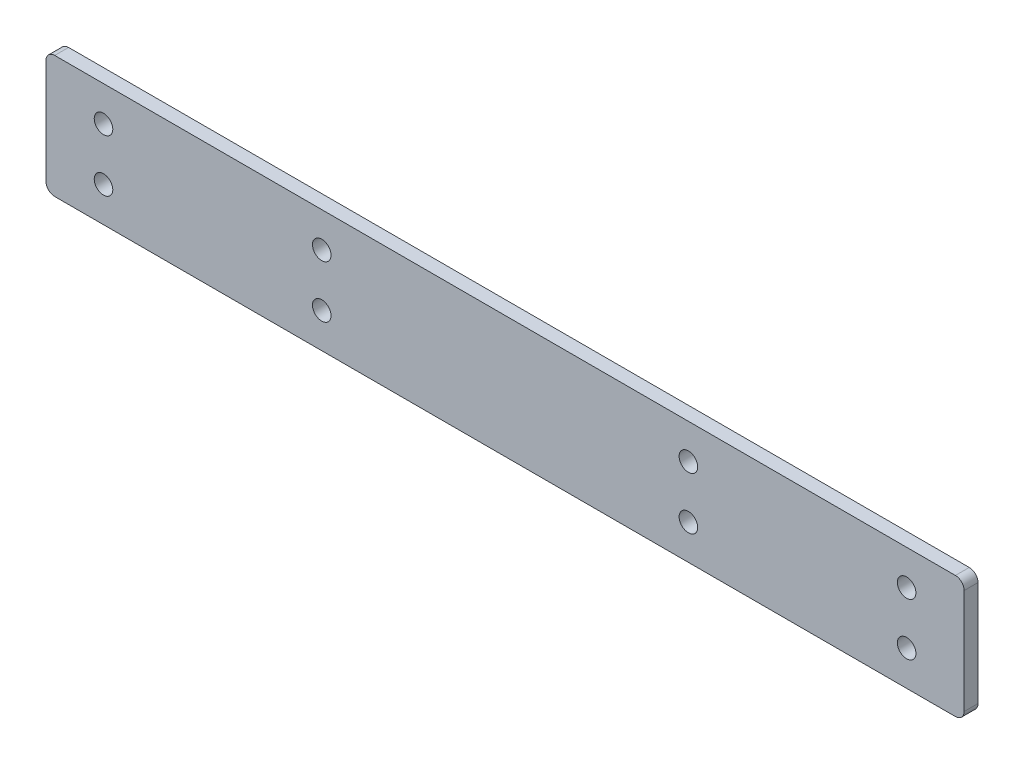
ISO-10303-21;
HEADER;
FILE_DESCRIPTION(('STEP AP214'),'2;1');
FILE_NAME('part.step','',(''),(''),'','','');
FILE_SCHEMA(('AUTOMOTIVE_DESIGN { 1 0 10303 214 1 1 1 1 }'));
ENDSEC;
DATA;
#1=APPLICATION_CONTEXT('core data for automotive mechanical design processes');
#2=APPLICATION_PROTOCOL_DEFINITION('international standard','automotive_design',2000,#1);
#3=PRODUCT_CONTEXT('',#1,'mechanical');
#4=PRODUCT('Part','Part','',(#3));
#5=PRODUCT_RELATED_PRODUCT_CATEGORY('part','',(#4));
#6=PRODUCT_DEFINITION_FORMATION('','',#4);
#7=PRODUCT_DEFINITION_CONTEXT('part definition',#1,'design');
#8=PRODUCT_DEFINITION('design','',#6,#7);
#9=PRODUCT_DEFINITION_SHAPE('','',#8);
#10=(LENGTH_UNIT() NAMED_UNIT(*) SI_UNIT(.MILLI.,.METRE.));
#11=(NAMED_UNIT(*) PLANE_ANGLE_UNIT() SI_UNIT($,.RADIAN.));
#12=(NAMED_UNIT(*) SI_UNIT($,.STERADIAN.) SOLID_ANGLE_UNIT());
#13=UNCERTAINTY_MEASURE_WITH_UNIT(LENGTH_MEASURE(1.E-05),#10,'distance_accuracy_value','');
#14=(GEOMETRIC_REPRESENTATION_CONTEXT(3) GLOBAL_UNCERTAINTY_ASSIGNED_CONTEXT((#13)) GLOBAL_UNIT_ASSIGNED_CONTEXT((#10,
#11,#12)) REPRESENTATION_CONTEXT('',''));
#15=CARTESIAN_POINT('',(0.,0.,0.));
#16=DIRECTION('',(0.,0.,1.));
#17=DIRECTION('',(1.,0.,0.));
#18=AXIS2_PLACEMENT_3D('',#15,#16,#17);
#19=CARTESIAN_POINT('',(0.,0.,3.175));
#20=DIRECTION('',(0.,0.,-1.));
#21=DIRECTION('',(-1.,0.,0.));
#22=AXIS2_PLACEMENT_3D('',#19,#20,#21);
#23=PLANE('',#22);
#24=DIRECTION('',(1.,0.,0.));
#25=VECTOR('',#24,1.);
#26=CARTESIAN_POINT('',(-105.175,-14.,3.175));
#27=LINE('',#26,#25);
#28=CARTESIAN_POINT('',(-103.175,-14.,3.175));
#29=VERTEX_POINT('',#28);
#30=CARTESIAN_POINT('',(103.175,-14.,3.175));
#31=VERTEX_POINT('',#30);
#32=EDGE_CURVE('E153',#29,#31,#27,.T.);
#33=ORIENTED_EDGE('',*,*,#32,.T.);
#34=CARTESIAN_POINT('',(103.175,-12.,3.175));
#35=DIRECTION('',(0.,0.,-1.));
#36=DIRECTION('',(-1.,0.,0.));
#37=AXIS2_PLACEMENT_3D('',#34,#35,#36);
#38=CIRCLE('',#37,2.);
#39=CARTESIAN_POINT('',(105.175,-12.,3.175));
#40=VERTEX_POINT('',#39);
#41=EDGE_CURVE('E183',#31,#40,#38,.F.);
#42=ORIENTED_EDGE('',*,*,#41,.T.);
#43=DIRECTION('',(0.,1.,0.));
#44=VECTOR('',#43,1.);
#45=CARTESIAN_POINT('',(105.175,-14.,3.175));
#46=LINE('',#45,#44);
#47=CARTESIAN_POINT('',(105.175,12.,3.175));
#48=VERTEX_POINT('',#47);
#49=EDGE_CURVE('E132',#40,#48,#46,.T.);
#50=ORIENTED_EDGE('',*,*,#49,.T.);
#51=CARTESIAN_POINT('',(103.175,12.,3.175));
#52=DIRECTION('',(0.,0.,-1.));
#53=DIRECTION('',(-1.,0.,0.));
#54=AXIS2_PLACEMENT_3D('',#51,#52,#53);
#55=CIRCLE('',#54,2.);
#56=CARTESIAN_POINT('',(103.175,14.,3.175));
#57=VERTEX_POINT('',#56);
#58=EDGE_CURVE('E180',#48,#57,#55,.F.);
#59=ORIENTED_EDGE('',*,*,#58,.T.);
#60=DIRECTION('',(-1.,0.,0.));
#61=VECTOR('',#60,1.);
#62=CARTESIAN_POINT('',(-105.175,14.,3.175));
#63=LINE('',#62,#61);
#64=CARTESIAN_POINT('',(-103.175,14.,3.175));
#65=VERTEX_POINT('',#64);
#66=EDGE_CURVE('E209',#57,#65,#63,.T.);
#67=ORIENTED_EDGE('',*,*,#66,.T.);
#68=CARTESIAN_POINT('',(-103.175,12.,3.175));
#69=DIRECTION('',(0.,0.,-1.));
#70=DIRECTION('',(-1.,0.,0.));
#71=AXIS2_PLACEMENT_3D('',#68,#69,#70);
#72=CIRCLE('',#71,2.);
#73=CARTESIAN_POINT('',(-105.175,12.,3.175));
#74=VERTEX_POINT('',#73);
#75=EDGE_CURVE('E66',#65,#74,#72,.F.);
#76=ORIENTED_EDGE('',*,*,#75,.T.);
#77=DIRECTION('',(0.,-1.,0.));
#78=VECTOR('',#77,1.);
#79=CARTESIAN_POINT('',(-105.175,-14.,3.175));
#80=LINE('',#79,#78);
#81=CARTESIAN_POINT('',(-105.175,-12.,3.175));
#82=VERTEX_POINT('',#81);
#83=EDGE_CURVE('E197',#74,#82,#80,.T.);
#84=ORIENTED_EDGE('',*,*,#83,.T.);
#85=CARTESIAN_POINT('',(-103.175,-12.,3.175));
#86=DIRECTION('',(0.,0.,-1.));
#87=DIRECTION('',(-1.,0.,0.));
#88=AXIS2_PLACEMENT_3D('',#85,#86,#87);
#89=CIRCLE('',#88,2.);
#90=EDGE_CURVE('E177',#82,#29,#89,.F.);
#91=ORIENTED_EDGE('',*,*,#90,.T.);
#92=EDGE_LOOP('',(#33,#42,#50,#59,#67,#76,#84,#91));
#93=FACE_BOUND('',#92,.T.);
#94=CARTESIAN_POINT('',(92.,6.,3.175));
#95=DIRECTION('',(0.,0.,1.));
#96=DIRECTION('',(1.,0.,0.));
#97=AXIS2_PLACEMENT_3D('',#94,#95,#96);
#98=CIRCLE('',#97,2.125);
#99=CARTESIAN_POINT('',(94.125,6.,3.175));
#100=VERTEX_POINT('',#99);
#101=EDGE_CURVE('E142',#100,#100,#98,.T.);
#102=ORIENTED_EDGE('',*,*,#101,.F.);
#103=EDGE_LOOP('',(#102));
#104=FACE_BOUND('',#103,.T.);
#105=CARTESIAN_POINT('',(92.,-6.,3.175));
#106=DIRECTION('',(0.,0.,1.));
#107=DIRECTION('',(-1.,0.,0.));
#108=AXIS2_PLACEMENT_3D('',#105,#106,#107);
#109=CIRCLE('',#108,2.125);
#110=CARTESIAN_POINT('',(89.875,-6.,3.175));
#111=VERTEX_POINT('',#110);
#112=EDGE_CURVE('E217',#111,#111,#109,.T.);
#113=ORIENTED_EDGE('',*,*,#112,.F.);
#114=EDGE_LOOP('',(#113));
#115=FACE_BOUND('',#114,.T.);
#116=CARTESIAN_POINT('',(-92.,-6.00000000000002,3.175));
#117=DIRECTION('',(0.,0.,1.));
#118=DIRECTION('',(1.,0.,0.));
#119=AXIS2_PLACEMENT_3D('',#116,#117,#118);
#120=CIRCLE('',#119,2.125);
#121=CARTESIAN_POINT('',(-89.875,-6.00000000000002,3.175));
#122=VERTEX_POINT('',#121);
#123=EDGE_CURVE('E223',#122,#122,#120,.T.);
#124=ORIENTED_EDGE('',*,*,#123,.F.);
#125=EDGE_LOOP('',(#124));
#126=FACE_BOUND('',#125,.T.);
#127=CARTESIAN_POINT('',(-92.,5.99999999999998,3.175));
#128=DIRECTION('',(0.,0.,1.));
#129=DIRECTION('',(-1.,0.,0.));
#130=AXIS2_PLACEMENT_3D('',#127,#128,#129);
#131=CIRCLE('',#130,2.125);
#132=CARTESIAN_POINT('',(-94.125,5.99999999999998,3.175));
#133=VERTEX_POINT('',#132);
#134=EDGE_CURVE('E231',#133,#133,#131,.T.);
#135=ORIENTED_EDGE('',*,*,#134,.F.);
#136=EDGE_LOOP('',(#135));
#137=FACE_BOUND('',#136,.T.);
#138=CARTESIAN_POINT('',(-42.,6.00000000000002,3.175));
#139=DIRECTION('',(0.,0.,1.));
#140=DIRECTION('',(1.,0.,0.));
#141=AXIS2_PLACEMENT_3D('',#138,#139,#140);
#142=CIRCLE('',#141,2.125);
#143=CARTESIAN_POINT('',(-39.875,6.00000000000002,3.175));
#144=VERTEX_POINT('',#143);
#145=EDGE_CURVE('E239',#144,#144,#142,.T.);
#146=ORIENTED_EDGE('',*,*,#145,.F.);
#147=EDGE_LOOP('',(#146));
#148=FACE_BOUND('',#147,.T.);
#149=CARTESIAN_POINT('',(-42.,-6.00000000000002,3.175));
#150=DIRECTION('',(0.,0.,1.));
#151=DIRECTION('',(-1.,0.,0.));
#152=AXIS2_PLACEMENT_3D('',#149,#150,#151);
#153=CIRCLE('',#152,2.125);
#154=CARTESIAN_POINT('',(-44.125,-6.00000000000002,3.175));
#155=VERTEX_POINT('',#154);
#156=EDGE_CURVE('E247',#155,#155,#153,.T.);
#157=ORIENTED_EDGE('',*,*,#156,.F.);
#158=EDGE_LOOP('',(#157));
#159=FACE_BOUND('',#158,.T.);
#160=CARTESIAN_POINT('',(42.,-6.00000000000001,3.175));
#161=DIRECTION('',(0.,0.,1.));
#162=DIRECTION('',(1.,0.,0.));
#163=AXIS2_PLACEMENT_3D('',#160,#161,#162);
#164=CIRCLE('',#163,2.125);
#165=CARTESIAN_POINT('',(44.125,-6.00000000000001,3.175));
#166=VERTEX_POINT('',#165);
#167=EDGE_CURVE('E255',#166,#166,#164,.T.);
#168=ORIENTED_EDGE('',*,*,#167,.F.);
#169=EDGE_LOOP('',(#168));
#170=FACE_BOUND('',#169,.T.);
#171=CARTESIAN_POINT('',(42.,6.00000000000003,3.175));
#172=DIRECTION('',(0.,0.,1.));
#173=DIRECTION('',(-1.,0.,0.));
#174=AXIS2_PLACEMENT_3D('',#171,#172,#173);
#175=CIRCLE('',#174,2.125);
#176=CARTESIAN_POINT('',(39.875,6.00000000000003,3.175));
#177=VERTEX_POINT('',#176);
#178=EDGE_CURVE('E263',#177,#177,#175,.T.);
#179=ORIENTED_EDGE('',*,*,#178,.F.);
#180=EDGE_LOOP('',(#179));
#181=FACE_BOUND('',#180,.T.);
#182=ADVANCED_FACE('F45',(#93,#104,#115,#126,#137,#148,#159,#170,#181),#23,.F.);
#183=CARTESIAN_POINT('',(0.,0.,0.));
#184=DIRECTION('',(0.,0.,-1.));
#185=DIRECTION('',(-1.,0.,0.));
#186=AXIS2_PLACEMENT_3D('',#183,#184,#185);
#187=PLANE('',#186);
#188=CARTESIAN_POINT('',(42.,-6.00000000000001,0.));
#189=DIRECTION('',(0.,0.,1.));
#190=DIRECTION('',(1.,0.,0.));
#191=AXIS2_PLACEMENT_3D('',#188,#189,#190);
#192=CIRCLE('',#191,2.125);
#193=CARTESIAN_POINT('',(44.125,-6.00000000000001,0.));
#194=VERTEX_POINT('',#193);
#195=EDGE_CURVE('E259',#194,#194,#192,.T.);
#196=ORIENTED_EDGE('',*,*,#195,.T.);
#197=EDGE_LOOP('',(#196));
#198=FACE_BOUND('',#197,.T.);
#199=CARTESIAN_POINT('',(-42.,6.00000000000002,0.));
#200=DIRECTION('',(0.,0.,1.));
#201=DIRECTION('',(1.,0.,0.));
#202=AXIS2_PLACEMENT_3D('',#199,#200,#201);
#203=CIRCLE('',#202,2.125);
#204=CARTESIAN_POINT('',(-39.875,6.00000000000002,0.));
#205=VERTEX_POINT('',#204);
#206=EDGE_CURVE('E243',#205,#205,#203,.T.);
#207=ORIENTED_EDGE('',*,*,#206,.T.);
#208=EDGE_LOOP('',(#207));
#209=FACE_BOUND('',#208,.T.);
#210=CARTESIAN_POINT('',(-92.,-6.00000000000002,0.));
#211=DIRECTION('',(0.,0.,1.));
#212=DIRECTION('',(1.,0.,0.));
#213=AXIS2_PLACEMENT_3D('',#210,#211,#212);
#214=CIRCLE('',#213,2.125);
#215=CARTESIAN_POINT('',(-89.875,-6.00000000000002,0.));
#216=VERTEX_POINT('',#215);
#217=EDGE_CURVE('E227',#216,#216,#214,.T.);
#218=ORIENTED_EDGE('',*,*,#217,.T.);
#219=EDGE_LOOP('',(#218));
#220=FACE_BOUND('',#219,.T.);
#221=CARTESIAN_POINT('',(92.,6.,0.));
#222=DIRECTION('',(0.,0.,1.));
#223=DIRECTION('',(1.,0.,0.));
#224=AXIS2_PLACEMENT_3D('',#221,#222,#223);
#225=CIRCLE('',#224,2.125);
#226=CARTESIAN_POINT('',(94.125,6.,0.));
#227=VERTEX_POINT('',#226);
#228=EDGE_CURVE('E150',#227,#227,#225,.T.);
#229=ORIENTED_EDGE('',*,*,#228,.T.);
#230=EDGE_LOOP('',(#229));
#231=FACE_BOUND('',#230,.T.);
#232=DIRECTION('',(0.,1.,0.));
#233=VECTOR('',#232,1.);
#234=CARTESIAN_POINT('',(105.175,-14.,0.));
#235=LINE('',#234,#233);
#236=CARTESIAN_POINT('',(105.175,-12.,0.));
#237=VERTEX_POINT('',#236);
#238=CARTESIAN_POINT('',(105.175,12.,0.));
#239=VERTEX_POINT('',#238);
#240=EDGE_CURVE('E129',#237,#239,#235,.T.);
#241=ORIENTED_EDGE('',*,*,#240,.F.);
#242=CARTESIAN_POINT('',(103.175,-12.,0.));
#243=DIRECTION('',(0.,0.,-1.));
#244=DIRECTION('',(-1.,0.,0.));
#245=AXIS2_PLACEMENT_3D('',#242,#243,#244);
#246=CIRCLE('',#245,2.);
#247=CARTESIAN_POINT('',(103.175,-14.,0.));
#248=VERTEX_POINT('',#247);
#249=EDGE_CURVE('E111',#237,#248,#246,.T.);
#250=ORIENTED_EDGE('',*,*,#249,.T.);
#251=DIRECTION('',(1.,0.,0.));
#252=VECTOR('',#251,1.);
#253=CARTESIAN_POINT('',(-105.175,-14.,0.));
#254=LINE('',#253,#252);
#255=CARTESIAN_POINT('',(-103.175,-14.,0.));
#256=VERTEX_POINT('',#255);
#257=EDGE_CURVE('E158',#256,#248,#254,.T.);
#258=ORIENTED_EDGE('',*,*,#257,.F.);
#259=CARTESIAN_POINT('',(-103.175,-12.,0.));
#260=DIRECTION('',(0.,0.,-1.));
#261=DIRECTION('',(-1.,0.,0.));
#262=AXIS2_PLACEMENT_3D('',#259,#260,#261);
#263=CIRCLE('',#262,2.);
#264=CARTESIAN_POINT('',(-105.175,-12.,0.));
#265=VERTEX_POINT('',#264);
#266=EDGE_CURVE('E165',#256,#265,#263,.T.);
#267=ORIENTED_EDGE('',*,*,#266,.T.);
#268=DIRECTION('',(0.,-1.,0.));
#269=VECTOR('',#268,1.);
#270=CARTESIAN_POINT('',(-105.175,-14.,0.));
#271=LINE('',#270,#269);
#272=CARTESIAN_POINT('',(-105.175,12.,0.));
#273=VERTEX_POINT('',#272);
#274=EDGE_CURVE('E147',#273,#265,#271,.T.);
#275=ORIENTED_EDGE('',*,*,#274,.F.);
#276=CARTESIAN_POINT('',(-103.175,12.,0.));
#277=DIRECTION('',(0.,0.,-1.));
#278=DIRECTION('',(-1.,0.,0.));
#279=AXIS2_PLACEMENT_3D('',#276,#277,#278);
#280=CIRCLE('',#279,2.);
#281=CARTESIAN_POINT('',(-103.175,14.,0.));
#282=VERTEX_POINT('',#281);
#283=EDGE_CURVE('E134',#273,#282,#280,.T.);
#284=ORIENTED_EDGE('',*,*,#283,.T.);
#285=DIRECTION('',(-1.,0.,0.));
#286=VECTOR('',#285,1.);
#287=CARTESIAN_POINT('',(-105.175,14.,0.));
#288=LINE('',#287,#286);
#289=CARTESIAN_POINT('',(103.175,14.,0.));
#290=VERTEX_POINT('',#289);
#291=EDGE_CURVE('E141',#290,#282,#288,.T.);
#292=ORIENTED_EDGE('',*,*,#291,.F.);
#293=CARTESIAN_POINT('',(103.175,12.,0.));
#294=DIRECTION('',(0.,0.,-1.));
#295=DIRECTION('',(-1.,0.,0.));
#296=AXIS2_PLACEMENT_3D('',#293,#294,#295);
#297=CIRCLE('',#296,2.);
#298=EDGE_CURVE('E123',#290,#239,#297,.T.);
#299=ORIENTED_EDGE('',*,*,#298,.T.);
#300=EDGE_LOOP('',(#241,#250,#258,#267,#275,#284,#292,#299));
#301=FACE_BOUND('',#300,.T.);
#302=CARTESIAN_POINT('',(92.,-6.,0.));
#303=DIRECTION('',(0.,0.,1.));
#304=DIRECTION('',(-1.,0.,0.));
#305=AXIS2_PLACEMENT_3D('',#302,#303,#304);
#306=CIRCLE('',#305,2.125);
#307=CARTESIAN_POINT('',(89.875,-6.,0.));
#308=VERTEX_POINT('',#307);
#309=EDGE_CURVE('E219',#308,#308,#306,.T.);
#310=ORIENTED_EDGE('',*,*,#309,.T.);
#311=EDGE_LOOP('',(#310));
#312=FACE_BOUND('',#311,.T.);
#313=CARTESIAN_POINT('',(-92.,5.99999999999998,0.));
#314=DIRECTION('',(0.,0.,1.));
#315=DIRECTION('',(-1.,0.,0.));
#316=AXIS2_PLACEMENT_3D('',#313,#314,#315);
#317=CIRCLE('',#316,2.125);
#318=CARTESIAN_POINT('',(-94.125,5.99999999999998,0.));
#319=VERTEX_POINT('',#318);
#320=EDGE_CURVE('E235',#319,#319,#317,.T.);
#321=ORIENTED_EDGE('',*,*,#320,.T.);
#322=EDGE_LOOP('',(#321));
#323=FACE_BOUND('',#322,.T.);
#324=CARTESIAN_POINT('',(-42.,-6.00000000000002,0.));
#325=DIRECTION('',(0.,0.,1.));
#326=DIRECTION('',(-1.,0.,0.));
#327=AXIS2_PLACEMENT_3D('',#324,#325,#326);
#328=CIRCLE('',#327,2.125);
#329=CARTESIAN_POINT('',(-44.125,-6.00000000000002,0.));
#330=VERTEX_POINT('',#329);
#331=EDGE_CURVE('E251',#330,#330,#328,.T.);
#332=ORIENTED_EDGE('',*,*,#331,.T.);
#333=EDGE_LOOP('',(#332));
#334=FACE_BOUND('',#333,.T.);
#335=CARTESIAN_POINT('',(42.,6.00000000000003,0.));
#336=DIRECTION('',(0.,0.,1.));
#337=DIRECTION('',(-1.,0.,0.));
#338=AXIS2_PLACEMENT_3D('',#335,#336,#337);
#339=CIRCLE('',#338,2.125);
#340=CARTESIAN_POINT('',(39.875,6.00000000000003,0.));
#341=VERTEX_POINT('',#340);
#342=EDGE_CURVE('E267',#341,#341,#339,.T.);
#343=ORIENTED_EDGE('',*,*,#342,.T.);
#344=EDGE_LOOP('',(#343));
#345=FACE_BOUND('',#344,.T.);
#346=ADVANCED_FACE('F137',(#198,#209,#220,#231,#301,#312,#323,#334,#345),#187,.T.);
#347=CARTESIAN_POINT('',(105.175,-14.,3.175));
#348=DIRECTION('',(-1.,0.,0.));
#349=DIRECTION('',(0.,0.,1.));
#350=AXIS2_PLACEMENT_3D('',#347,#348,#349);
#351=PLANE('',#350);
#352=ORIENTED_EDGE('',*,*,#49,.F.);
#353=DIRECTION('',(0.,0.,-1.));
#354=VECTOR('',#353,1.);
#355=CARTESIAN_POINT('',(105.175,-12.,3.175));
#356=LINE('',#355,#354);
#357=EDGE_CURVE('E115',#40,#237,#356,.T.);
#358=ORIENTED_EDGE('',*,*,#357,.T.);
#359=ORIENTED_EDGE('',*,*,#240,.T.);
#360=DIRECTION('',(0.,0.,-1.));
#361=VECTOR('',#360,1.);
#362=CARTESIAN_POINT('',(105.175,12.,3.175));
#363=LINE('',#362,#361);
#364=EDGE_CURVE('E135',#239,#48,#363,.F.);
#365=ORIENTED_EDGE('',*,*,#364,.T.);
#366=EDGE_LOOP('',(#352,#358,#359,#365));
#367=FACE_BOUND('',#366,.T.);
#368=ADVANCED_FACE('F128',(#367),#351,.F.);
#369=CARTESIAN_POINT('',(-105.175,14.,3.175));
#370=DIRECTION('',(0.,-1.,0.));
#371=DIRECTION('',(1.,0.,0.));
#372=AXIS2_PLACEMENT_3D('',#369,#370,#371);
#373=PLANE('',#372);
#374=ORIENTED_EDGE('',*,*,#66,.F.);
#375=DIRECTION('',(0.,0.,-1.));
#376=VECTOR('',#375,1.);
#377=CARTESIAN_POINT('',(103.175,14.,3.175));
#378=LINE('',#377,#376);
#379=EDGE_CURVE('E189',#57,#290,#378,.T.);
#380=ORIENTED_EDGE('',*,*,#379,.T.);
#381=ORIENTED_EDGE('',*,*,#291,.T.);
#382=DIRECTION('',(0.,0.,-1.));
#383=VECTOR('',#382,1.);
#384=CARTESIAN_POINT('',(-103.175,14.,3.175));
#385=LINE('',#384,#383);
#386=EDGE_CURVE('E186',#282,#65,#385,.F.);
#387=ORIENTED_EDGE('',*,*,#386,.T.);
#388=EDGE_LOOP('',(#374,#380,#381,#387));
#389=FACE_BOUND('',#388,.T.);
#390=ADVANCED_FACE('F295',(#389),#373,.F.);
#391=CARTESIAN_POINT('',(-105.175,-14.,3.175));
#392=DIRECTION('',(1.,0.,0.));
#393=DIRECTION('',(0.,0.,-1.));
#394=AXIS2_PLACEMENT_3D('',#391,#392,#393);
#395=PLANE('',#394);
#396=ORIENTED_EDGE('',*,*,#274,.T.);
#397=DIRECTION('',(0.,0.,-1.));
#398=VECTOR('',#397,1.);
#399=CARTESIAN_POINT('',(-105.175,-12.,3.175));
#400=LINE('',#399,#398);
#401=EDGE_CURVE('E11',#265,#82,#400,.F.);
#402=ORIENTED_EDGE('',*,*,#401,.T.);
#403=ORIENTED_EDGE('',*,*,#83,.F.);
#404=DIRECTION('',(0.,0.,-1.));
#405=VECTOR('',#404,1.);
#406=CARTESIAN_POINT('',(-105.175,12.,3.175));
#407=LINE('',#406,#405);
#408=EDGE_CURVE('E54',#74,#273,#407,.T.);
#409=ORIENTED_EDGE('',*,*,#408,.T.);
#410=EDGE_LOOP('',(#396,#402,#403,#409));
#411=FACE_BOUND('',#410,.T.);
#412=ADVANCED_FACE('F196',(#411),#395,.F.);
#413=CARTESIAN_POINT('',(-105.175,-14.,3.175));
#414=DIRECTION('',(0.,1.,0.));
#415=DIRECTION('',(-1.,0.,0.));
#416=AXIS2_PLACEMENT_3D('',#413,#414,#415);
#417=PLANE('',#416);
#418=ORIENTED_EDGE('',*,*,#257,.T.);
#419=DIRECTION('',(0.,0.,-1.));
#420=VECTOR('',#419,1.);
#421=CARTESIAN_POINT('',(103.175,-14.,3.175));
#422=LINE('',#421,#420);
#423=EDGE_CURVE('E116',#248,#31,#422,.F.);
#424=ORIENTED_EDGE('',*,*,#423,.T.);
#425=ORIENTED_EDGE('',*,*,#32,.F.);
#426=DIRECTION('',(0.,0.,-1.));
#427=VECTOR('',#426,1.);
#428=CARTESIAN_POINT('',(-103.175,-14.,3.175));
#429=LINE('',#428,#427);
#430=EDGE_CURVE('E122',#29,#256,#429,.T.);
#431=ORIENTED_EDGE('',*,*,#430,.T.);
#432=EDGE_LOOP('',(#418,#424,#425,#431));
#433=FACE_BOUND('',#432,.T.);
#434=ADVANCED_FACE('F205',(#433),#417,.F.);
#435=CARTESIAN_POINT('',(92.,6.,3.175));
#436=DIRECTION('',(0.,0.,-1.));
#437=DIRECTION('',(-1.,0.,0.));
#438=AXIS2_PLACEMENT_3D('',#435,#436,#437);
#439=CYLINDRICAL_SURFACE('',#438,2.125);
#440=ORIENTED_EDGE('',*,*,#101,.T.);
#441=EDGE_LOOP('',(#440));
#442=FACE_BOUND('',#441,.T.);
#443=ORIENTED_EDGE('',*,*,#228,.F.);
#444=EDGE_LOOP('',(#443));
#445=FACE_BOUND('',#444,.T.);
#446=ADVANCED_FACE('F288',(#442,#445),#439,.F.);
#447=CARTESIAN_POINT('',(92.,-6.,3.175));
#448=DIRECTION('',(0.,0.,-1.));
#449=DIRECTION('',(-1.,0.,0.));
#450=AXIS2_PLACEMENT_3D('',#447,#448,#449);
#451=CYLINDRICAL_SURFACE('',#450,2.125);
#452=ORIENTED_EDGE('',*,*,#112,.T.);
#453=EDGE_LOOP('',(#452));
#454=FACE_BOUND('',#453,.T.);
#455=ORIENTED_EDGE('',*,*,#309,.F.);
#456=EDGE_LOOP('',(#455));
#457=FACE_BOUND('',#456,.T.);
#458=ADVANCED_FACE('F390',(#454,#457),#451,.F.);
#459=CARTESIAN_POINT('',(-92.,-6.00000000000002,3.175));
#460=DIRECTION('',(0.,0.,-1.));
#461=DIRECTION('',(-1.,0.,0.));
#462=AXIS2_PLACEMENT_3D('',#459,#460,#461);
#463=CYLINDRICAL_SURFACE('',#462,2.125);
#464=ORIENTED_EDGE('',*,*,#123,.T.);
#465=EDGE_LOOP('',(#464));
#466=FACE_BOUND('',#465,.T.);
#467=ORIENTED_EDGE('',*,*,#217,.F.);
#468=EDGE_LOOP('',(#467));
#469=FACE_BOUND('',#468,.T.);
#470=ADVANCED_FACE('F380',(#466,#469),#463,.F.);
#471=CARTESIAN_POINT('',(-92.,5.99999999999998,3.175));
#472=DIRECTION('',(0.,0.,-1.));
#473=DIRECTION('',(-1.,0.,0.));
#474=AXIS2_PLACEMENT_3D('',#471,#472,#473);
#475=CYLINDRICAL_SURFACE('',#474,2.125);
#476=ORIENTED_EDGE('',*,*,#134,.T.);
#477=EDGE_LOOP('',(#476));
#478=FACE_BOUND('',#477,.T.);
#479=ORIENTED_EDGE('',*,*,#320,.F.);
#480=EDGE_LOOP('',(#479));
#481=FACE_BOUND('',#480,.T.);
#482=ADVANCED_FACE('F370',(#478,#481),#475,.F.);
#483=CARTESIAN_POINT('',(-42.,6.00000000000002,3.175));
#484=DIRECTION('',(0.,0.,-1.));
#485=DIRECTION('',(-1.,0.,0.));
#486=AXIS2_PLACEMENT_3D('',#483,#484,#485);
#487=CYLINDRICAL_SURFACE('',#486,2.125);
#488=ORIENTED_EDGE('',*,*,#145,.T.);
#489=EDGE_LOOP('',(#488));
#490=FACE_BOUND('',#489,.T.);
#491=ORIENTED_EDGE('',*,*,#206,.F.);
#492=EDGE_LOOP('',(#491));
#493=FACE_BOUND('',#492,.T.);
#494=ADVANCED_FACE('F360',(#490,#493),#487,.F.);
#495=CARTESIAN_POINT('',(-42.,-6.00000000000002,3.175));
#496=DIRECTION('',(0.,0.,-1.));
#497=DIRECTION('',(-1.,0.,0.));
#498=AXIS2_PLACEMENT_3D('',#495,#496,#497);
#499=CYLINDRICAL_SURFACE('',#498,2.125);
#500=ORIENTED_EDGE('',*,*,#156,.T.);
#501=EDGE_LOOP('',(#500));
#502=FACE_BOUND('',#501,.T.);
#503=ORIENTED_EDGE('',*,*,#331,.F.);
#504=EDGE_LOOP('',(#503));
#505=FACE_BOUND('',#504,.T.);
#506=ADVANCED_FACE('F350',(#502,#505),#499,.F.);
#507=CARTESIAN_POINT('',(42.,-6.00000000000001,3.175));
#508=DIRECTION('',(0.,0.,-1.));
#509=DIRECTION('',(-1.,0.,0.));
#510=AXIS2_PLACEMENT_3D('',#507,#508,#509);
#511=CYLINDRICAL_SURFACE('',#510,2.125);
#512=ORIENTED_EDGE('',*,*,#167,.T.);
#513=EDGE_LOOP('',(#512));
#514=FACE_BOUND('',#513,.T.);
#515=ORIENTED_EDGE('',*,*,#195,.F.);
#516=EDGE_LOOP('',(#515));
#517=FACE_BOUND('',#516,.T.);
#518=ADVANCED_FACE('F341',(#514,#517),#511,.F.);
#519=CARTESIAN_POINT('',(42.,6.00000000000003,3.175));
#520=DIRECTION('',(0.,0.,-1.));
#521=DIRECTION('',(-1.,0.,0.));
#522=AXIS2_PLACEMENT_3D('',#519,#520,#521);
#523=CYLINDRICAL_SURFACE('',#522,2.125);
#524=ORIENTED_EDGE('',*,*,#178,.T.);
#525=EDGE_LOOP('',(#524));
#526=FACE_BOUND('',#525,.T.);
#527=ORIENTED_EDGE('',*,*,#342,.F.);
#528=EDGE_LOOP('',(#527));
#529=FACE_BOUND('',#528,.T.);
#530=ADVANCED_FACE('F275',(#526,#529),#523,.F.);
#531=CARTESIAN_POINT('',(103.175,-12.,3.175));
#532=DIRECTION('',(0.,0.,-1.));
#533=DIRECTION('',(-1.,0.,0.));
#534=AXIS2_PLACEMENT_3D('',#531,#532,#533);
#535=CYLINDRICAL_SURFACE('',#534,2.);
#536=ORIENTED_EDGE('',*,*,#41,.F.);
#537=ORIENTED_EDGE('',*,*,#423,.F.);
#538=ORIENTED_EDGE('',*,*,#249,.F.);
#539=ORIENTED_EDGE('',*,*,#357,.F.);
#540=EDGE_LOOP('',(#536,#537,#538,#539));
#541=FACE_BOUND('',#540,.T.);
#542=ADVANCED_FACE('F114',(#541),#535,.T.);
#543=CARTESIAN_POINT('',(103.175,12.,3.175));
#544=DIRECTION('',(0.,0.,-1.));
#545=DIRECTION('',(-1.,0.,0.));
#546=AXIS2_PLACEMENT_3D('',#543,#544,#545);
#547=CYLINDRICAL_SURFACE('',#546,2.);
#548=ORIENTED_EDGE('',*,*,#58,.F.);
#549=ORIENTED_EDGE('',*,*,#364,.F.);
#550=ORIENTED_EDGE('',*,*,#298,.F.);
#551=ORIENTED_EDGE('',*,*,#379,.F.);
#552=EDGE_LOOP('',(#548,#549,#550,#551));
#553=FACE_BOUND('',#552,.T.);
#554=ADVANCED_FACE('F303',(#553),#547,.T.);
#555=CARTESIAN_POINT('',(-103.175,-12.,3.175));
#556=DIRECTION('',(0.,0.,-1.));
#557=DIRECTION('',(-1.,0.,0.));
#558=AXIS2_PLACEMENT_3D('',#555,#556,#557);
#559=CYLINDRICAL_SURFACE('',#558,2.);
#560=ORIENTED_EDGE('',*,*,#90,.F.);
#561=ORIENTED_EDGE('',*,*,#401,.F.);
#562=ORIENTED_EDGE('',*,*,#266,.F.);
#563=ORIENTED_EDGE('',*,*,#430,.F.);
#564=EDGE_LOOP('',(#560,#561,#562,#563));
#565=FACE_BOUND('',#564,.T.);
#566=ADVANCED_FACE('F202',(#565),#559,.T.);
#567=CARTESIAN_POINT('',(-103.175,12.,3.175));
#568=DIRECTION('',(0.,0.,-1.));
#569=DIRECTION('',(-1.,0.,0.));
#570=AXIS2_PLACEMENT_3D('',#567,#568,#569);
#571=CYLINDRICAL_SURFACE('',#570,2.);
#572=ORIENTED_EDGE('',*,*,#75,.F.);
#573=ORIENTED_EDGE('',*,*,#386,.F.);
#574=ORIENTED_EDGE('',*,*,#283,.F.);
#575=ORIENTED_EDGE('',*,*,#408,.F.);
#576=EDGE_LOOP('',(#572,#573,#574,#575));
#577=FACE_BOUND('',#576,.T.);
#578=ADVANCED_FACE('F47',(#577),#571,.T.);
#579=CLOSED_SHELL('',(#182,#346,#368,#390,#412,#434,#446,#458,#470,#482,#494,#506,#518,#530,
#542,#554,#566,#578));
#580=MANIFOLD_SOLID_BREP('B2',#579);
#581=ADVANCED_BREP_SHAPE_REPRESENTATION('',(#18,#580),#14);
#582=SHAPE_DEFINITION_REPRESENTATION(#9,#581);
ENDSEC;
END-ISO-10303-21;
